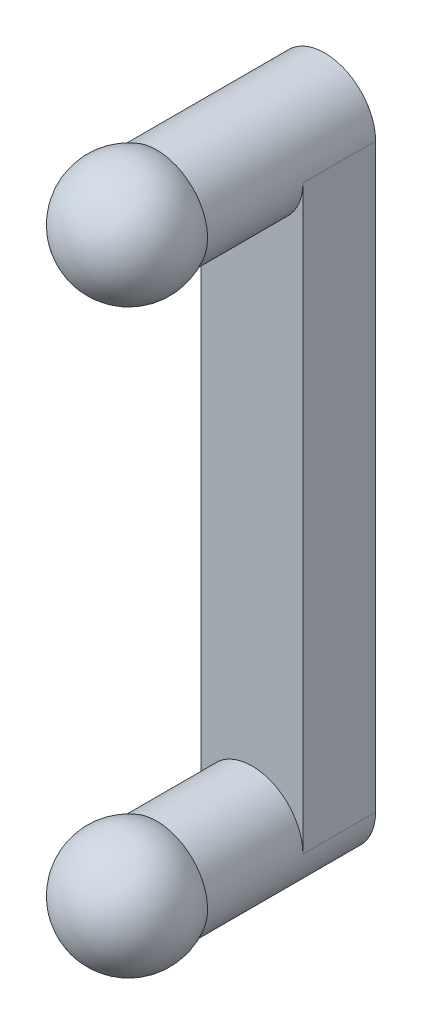
ISO-10303-21;
HEADER;
FILE_DESCRIPTION(('STEP AP214'),'2;1');
FILE_NAME('part.step','',(''),(''),'','','');
FILE_SCHEMA(('AUTOMOTIVE_DESIGN { 1 0 10303 214 1 1 1 1 }'));
ENDSEC;
DATA;
#1=APPLICATION_CONTEXT('core data for automotive mechanical design processes');
#2=APPLICATION_PROTOCOL_DEFINITION('international standard','automotive_design',2000,#1);
#3=PRODUCT_CONTEXT('',#1,'mechanical');
#4=PRODUCT('Part','Part','',(#3));
#5=PRODUCT_RELATED_PRODUCT_CATEGORY('part','',(#4));
#6=PRODUCT_DEFINITION_FORMATION('','',#4);
#7=PRODUCT_DEFINITION_CONTEXT('part definition',#1,'design');
#8=PRODUCT_DEFINITION('design','',#6,#7);
#9=PRODUCT_DEFINITION_SHAPE('','',#8);
#10=(LENGTH_UNIT() NAMED_UNIT(*) SI_UNIT(.MILLI.,.METRE.));
#11=(NAMED_UNIT(*) PLANE_ANGLE_UNIT() SI_UNIT($,.RADIAN.));
#12=(NAMED_UNIT(*) SI_UNIT($,.STERADIAN.) SOLID_ANGLE_UNIT());
#13=UNCERTAINTY_MEASURE_WITH_UNIT(LENGTH_MEASURE(1.E-05),#10,'distance_accuracy_value','');
#14=(GEOMETRIC_REPRESENTATION_CONTEXT(3) GLOBAL_UNCERTAINTY_ASSIGNED_CONTEXT((#13)) GLOBAL_UNIT_ASSIGNED_CONTEXT((#10,
#11,#12)) REPRESENTATION_CONTEXT('',''));
#15=CARTESIAN_POINT('',(0.,0.,0.));
#16=DIRECTION('',(0.,0.,1.));
#17=DIRECTION('',(1.,0.,0.));
#18=AXIS2_PLACEMENT_3D('',#15,#16,#17);
#19=CARTESIAN_POINT('',(0.,0.,0.));
#20=DIRECTION('',(0.,0.,1.));
#21=DIRECTION('',(1.,0.,0.));
#22=AXIS2_PLACEMENT_3D('',#19,#20,#21);
#23=PLANE('',#22);
#24=CARTESIAN_POINT('',(0.,0.,0.));
#25=DIRECTION('',(0.,0.,-1.));
#26=DIRECTION('',(-1.,0.,0.));
#27=AXIS2_PLACEMENT_3D('',#24,#25,#26);
#28=CIRCLE('',#27,1.4);
#29=CARTESIAN_POINT('',(1.4,0.,0.));
#30=VERTEX_POINT('',#29);
#31=CARTESIAN_POINT('',(-1.4,0.,0.));
#32=VERTEX_POINT('',#31);
#33=EDGE_CURVE('E48',#30,#32,#28,.T.);
#34=ORIENTED_EDGE('',*,*,#33,.T.);
#35=DIRECTION('',(0.,1.,0.));
#36=VECTOR('',#35,1.);
#37=CARTESIAN_POINT('',(-1.4,0.,0.));
#38=LINE('',#37,#36);
#39=CARTESIAN_POINT('',(-1.4,16.,0.));
#40=VERTEX_POINT('',#39);
#41=EDGE_CURVE('E72',#32,#40,#38,.T.);
#42=ORIENTED_EDGE('',*,*,#41,.T.);
#43=CARTESIAN_POINT('',(0.,16.,0.));
#44=DIRECTION('',(0.,0.,1.));
#45=DIRECTION('',(-1.,0.,0.));
#46=AXIS2_PLACEMENT_3D('',#43,#44,#45);
#47=CIRCLE('',#46,1.4);
#48=CARTESIAN_POINT('',(1.4,16.,0.));
#49=VERTEX_POINT('',#48);
#50=EDGE_CURVE('E103',#49,#40,#47,.T.);
#51=ORIENTED_EDGE('',*,*,#50,.F.);
#52=DIRECTION('',(0.,-1.,0.));
#53=VECTOR('',#52,1.);
#54=CARTESIAN_POINT('',(1.4,0.,0.));
#55=LINE('',#54,#53);
#56=EDGE_CURVE('E55',#49,#30,#55,.T.);
#57=ORIENTED_EDGE('',*,*,#56,.T.);
#58=EDGE_LOOP('',(#34,#42,#51,#57));
#59=FACE_BOUND('',#58,.T.);
#60=ADVANCED_FACE('F41',(#59),#23,.F.);
#61=CARTESIAN_POINT('',(0.,0.,-1.6476499031235));
#62=DIRECTION('',(0.,0.,-1.));
#63=DIRECTION('',(-1.,0.,0.));
#64=AXIS2_PLACEMENT_3D('',#61,#62,#63);
#65=CYLINDRICAL_SURFACE('',#64,1.4);
#66=DIRECTION('',(0.,0.,-1.));
#67=VECTOR('',#66,1.);
#68=CARTESIAN_POINT('',(-1.4,0.,2.));
#69=LINE('',#68,#67);
#70=CARTESIAN_POINT('',(-1.4,0.,2.));
#71=VERTEX_POINT('',#70);
#72=EDGE_CURVE('E64',#71,#32,#69,.T.);
#73=ORIENTED_EDGE('',*,*,#72,.T.);
#74=ORIENTED_EDGE('',*,*,#33,.F.);
#75=DIRECTION('',(0.,0.,-1.));
#76=VECTOR('',#75,1.);
#77=CARTESIAN_POINT('',(1.4,0.,2.));
#78=LINE('',#77,#76);
#79=CARTESIAN_POINT('',(1.4,0.,2.));
#80=VERTEX_POINT('',#79);
#81=EDGE_CURVE('E110',#80,#30,#78,.T.);
#82=ORIENTED_EDGE('',*,*,#81,.F.);
#83=CARTESIAN_POINT('',(0.,0.,2.));
#84=DIRECTION('',(0.,0.,1.));
#85=DIRECTION('',(1.,0.,0.));
#86=AXIS2_PLACEMENT_3D('',#83,#84,#85);
#87=CIRCLE('',#86,1.4);
#88=EDGE_CURVE('E11',#71,#80,#87,.F.);
#89=ORIENTED_EDGE('',*,*,#88,.F.);
#90=EDGE_LOOP('',(#73,#74,#82,#89));
#91=FACE_BOUND('',#90,.T.);
#92=CARTESIAN_POINT('',(0.,0.,4.62540333075852));
#93=DIRECTION('',(0.,0.,-1.));
#94=DIRECTION('',(-1.,0.,0.));
#95=AXIS2_PLACEMENT_3D('',#92,#93,#94);
#96=CIRCLE('',#95,1.4);
#97=CARTESIAN_POINT('',(-1.4,0.,4.62540333075852));
#98=VERTEX_POINT('',#97);
#99=EDGE_CURVE('E114',#98,#98,#96,.T.);
#100=ORIENTED_EDGE('',*,*,#99,.T.);
#101=EDGE_LOOP('',(#100));
#102=FACE_BOUND('',#101,.T.);
#103=ADVANCED_FACE('F119',(#91,#102),#65,.T.);
#104=CARTESIAN_POINT('',(0.,0.,5.4));
#105=DIRECTION('',(0.,0.,-1.));
#106=DIRECTION('',(-1.,0.,0.));
#107=AXIS2_PLACEMENT_3D('',#104,#105,#106);
#108=SPHERICAL_SURFACE('',#107,1.6);
#109=ORIENTED_EDGE('',*,*,#99,.F.);
#110=EDGE_LOOP('',(#109));
#111=FACE_BOUND('',#110,.T.);
#112=ADVANCED_FACE('F122',(#111),#108,.T.);
#113=CARTESIAN_POINT('',(1.4,0.,2.));
#114=DIRECTION('',(1.,0.,0.));
#115=DIRECTION('',(0.,0.,-1.));
#116=AXIS2_PLACEMENT_3D('',#113,#114,#115);
#117=PLANE('',#116);
#118=ORIENTED_EDGE('',*,*,#56,.F.);
#119=DIRECTION('',(0.,0.,-1.));
#120=VECTOR('',#119,1.);
#121=CARTESIAN_POINT('',(1.4,16.,2.));
#122=LINE('',#121,#120);
#123=CARTESIAN_POINT('',(1.4,16.,2.));
#124=VERTEX_POINT('',#123);
#125=EDGE_CURVE('E95',#124,#49,#122,.T.);
#126=ORIENTED_EDGE('',*,*,#125,.F.);
#127=DIRECTION('',(0.,-1.,0.));
#128=VECTOR('',#127,1.);
#129=CARTESIAN_POINT('',(1.4,0.,2.));
#130=LINE('',#129,#128);
#131=EDGE_CURVE('E86',#124,#80,#130,.T.);
#132=ORIENTED_EDGE('',*,*,#131,.T.);
#133=ORIENTED_EDGE('',*,*,#81,.T.);
#134=EDGE_LOOP('',(#118,#126,#132,#133));
#135=FACE_BOUND('',#134,.T.);
#136=ADVANCED_FACE('F96',(#135),#117,.T.);
#137=CARTESIAN_POINT('',(-1.4,0.,2.));
#138=DIRECTION('',(-1.,0.,0.));
#139=DIRECTION('',(0.,-1.,0.));
#140=AXIS2_PLACEMENT_3D('',#137,#138,#139);
#141=PLANE('',#140);
#142=ORIENTED_EDGE('',*,*,#41,.F.);
#143=ORIENTED_EDGE('',*,*,#72,.F.);
#144=DIRECTION('',(0.,1.,0.));
#145=VECTOR('',#144,1.);
#146=CARTESIAN_POINT('',(-1.4,0.,2.));
#147=LINE('',#146,#145);
#148=CARTESIAN_POINT('',(-1.4,16.,2.));
#149=VERTEX_POINT('',#148);
#150=EDGE_CURVE('E93',#71,#149,#147,.T.);
#151=ORIENTED_EDGE('',*,*,#150,.T.);
#152=DIRECTION('',(0.,0.,-1.));
#153=VECTOR('',#152,1.);
#154=CARTESIAN_POINT('',(-1.4,16.,2.));
#155=LINE('',#154,#153);
#156=EDGE_CURVE('E99',#149,#40,#155,.T.);
#157=ORIENTED_EDGE('',*,*,#156,.T.);
#158=EDGE_LOOP('',(#142,#143,#151,#157));
#159=FACE_BOUND('',#158,.T.);
#160=ADVANCED_FACE('F130',(#159),#141,.T.);
#161=CARTESIAN_POINT('',(0.,0.,2.));
#162=DIRECTION('',(0.,0.,1.));
#163=DIRECTION('',(1.,0.,0.));
#164=AXIS2_PLACEMENT_3D('',#161,#162,#163);
#165=PLANE('',#164);
#166=ORIENTED_EDGE('',*,*,#150,.F.);
#167=ORIENTED_EDGE('',*,*,#88,.T.);
#168=ORIENTED_EDGE('',*,*,#131,.F.);
#169=CARTESIAN_POINT('',(0.,16.,2.));
#170=DIRECTION('',(0.,0.,-1.));
#171=DIRECTION('',(1.,0.,0.));
#172=AXIS2_PLACEMENT_3D('',#169,#170,#171);
#173=CIRCLE('',#172,1.4);
#174=EDGE_CURVE('E89',#149,#124,#173,.F.);
#175=ORIENTED_EDGE('',*,*,#174,.F.);
#176=EDGE_LOOP('',(#166,#167,#168,#175));
#177=FACE_BOUND('',#176,.T.);
#178=ADVANCED_FACE('F87',(#177),#165,.T.);
#179=CARTESIAN_POINT('',(0.,16.,-1.6476499031235));
#180=DIRECTION('',(0.,0.,-1.));
#181=DIRECTION('',(-1.,0.,0.));
#182=AXIS2_PLACEMENT_3D('',#179,#180,#181);
#183=CYLINDRICAL_SURFACE('',#182,1.4);
#184=ORIENTED_EDGE('',*,*,#156,.F.);
#185=ORIENTED_EDGE('',*,*,#174,.T.);
#186=ORIENTED_EDGE('',*,*,#125,.T.);
#187=ORIENTED_EDGE('',*,*,#50,.T.);
#188=EDGE_LOOP('',(#184,#185,#186,#187));
#189=FACE_BOUND('',#188,.T.);
#190=CARTESIAN_POINT('',(0.,16.,4.62540333075852));
#191=DIRECTION('',(0.,0.,1.));
#192=DIRECTION('',(-1.,0.,0.));
#193=AXIS2_PLACEMENT_3D('',#190,#191,#192);
#194=CIRCLE('',#193,1.4);
#195=CARTESIAN_POINT('',(-1.4,16.,4.62540333075852));
#196=VERTEX_POINT('',#195);
#197=EDGE_CURVE('E106',#196,#196,#194,.T.);
#198=ORIENTED_EDGE('',*,*,#197,.F.);
#199=EDGE_LOOP('',(#198));
#200=FACE_BOUND('',#199,.T.);
#201=ADVANCED_FACE('F101',(#189,#200),#183,.T.);
#202=CARTESIAN_POINT('',(0.,16.,5.4));
#203=DIRECTION('',(0.,0.,-1.));
#204=DIRECTION('',(-1.,0.,0.));
#205=AXIS2_PLACEMENT_3D('',#202,#203,#204);
#206=SPHERICAL_SURFACE('',#205,1.6);
#207=ORIENTED_EDGE('',*,*,#197,.T.);
#208=EDGE_LOOP('',(#207));
#209=FACE_BOUND('',#208,.T.);
#210=ADVANCED_FACE('F177',(#209),#206,.T.);
#211=CLOSED_SHELL('',(#60,#103,#112,#136,#160,#178,#201,#210));
#212=MANIFOLD_SOLID_BREP('B2',#211);
#213=ADVANCED_BREP_SHAPE_REPRESENTATION('',(#18,#212),#14);
#214=SHAPE_DEFINITION_REPRESENTATION(#9,#213);
ENDSEC;
END-ISO-10303-21;
